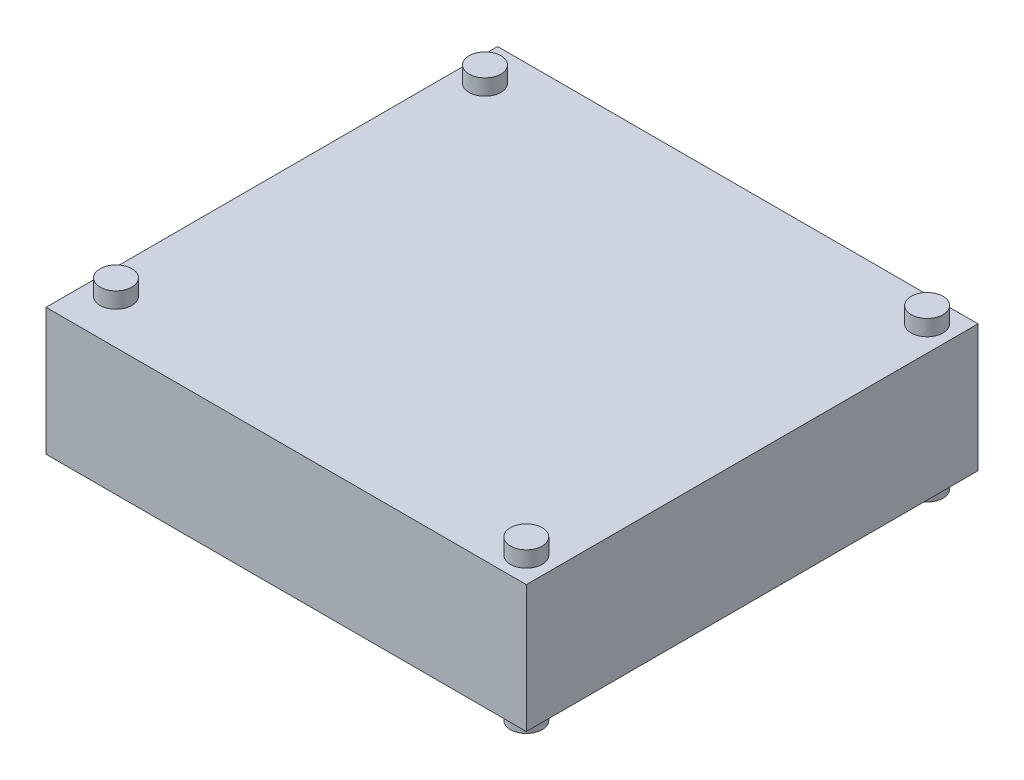
ISO-10303-21;
HEADER;
FILE_DESCRIPTION(('STEP AP214'),'2;1');
FILE_NAME('part.step','',(''),(''),'','','');
FILE_SCHEMA(('AUTOMOTIVE_DESIGN { 1 0 10303 214 1 1 1 1 }'));
ENDSEC;
DATA;
#1=APPLICATION_CONTEXT('core data for automotive mechanical design processes');
#2=APPLICATION_PROTOCOL_DEFINITION('international standard','automotive_design',2000,#1);
#3=PRODUCT_CONTEXT('',#1,'mechanical');
#4=PRODUCT('Part','Part','',(#3));
#5=PRODUCT_RELATED_PRODUCT_CATEGORY('part','',(#4));
#6=PRODUCT_DEFINITION_FORMATION('','',#4);
#7=PRODUCT_DEFINITION_CONTEXT('part definition',#1,'design');
#8=PRODUCT_DEFINITION('design','',#6,#7);
#9=PRODUCT_DEFINITION_SHAPE('','',#8);
#10=(LENGTH_UNIT() NAMED_UNIT(*) SI_UNIT(.MILLI.,.METRE.));
#11=(NAMED_UNIT(*) PLANE_ANGLE_UNIT() SI_UNIT($,.RADIAN.));
#12=(NAMED_UNIT(*) SI_UNIT($,.STERADIAN.) SOLID_ANGLE_UNIT());
#13=UNCERTAINTY_MEASURE_WITH_UNIT(LENGTH_MEASURE(1.E-05),#10,'distance_accuracy_value','');
#14=(GEOMETRIC_REPRESENTATION_CONTEXT(3) GLOBAL_UNCERTAINTY_ASSIGNED_CONTEXT((#13)) GLOBAL_UNIT_ASSIGNED_CONTEXT((#10,
#11,#12)) REPRESENTATION_CONTEXT('',''));
#15=CARTESIAN_POINT('',(0.,0.,0.));
#16=DIRECTION('',(0.,0.,1.));
#17=DIRECTION('',(1.,0.,0.));
#18=AXIS2_PLACEMENT_3D('',#15,#16,#17);
#19=CARTESIAN_POINT('',(0.,25.4,0.));
#20=DIRECTION('',(0.,1.,0.));
#21=DIRECTION('',(0.,0.,1.));
#22=AXIS2_PLACEMENT_3D('',#19,#20,#21);
#23=PLANE('',#22);
#24=CARTESIAN_POINT('',(42.8625,25.4,-40.005));
#25=DIRECTION('',(0.,1.,0.));
#26=DIRECTION('',(0.,0.,1.));
#27=AXIS2_PLACEMENT_3D('',#24,#25,#26);
#28=CIRCLE('',#27,3.175);
#29=CARTESIAN_POINT('',(42.8625,25.4,-36.83));
#30=VERTEX_POINT('',#29);
#31=EDGE_CURVE('E116',#30,#30,#28,.T.);
#32=ORIENTED_EDGE('',*,*,#31,.F.);
#33=EDGE_LOOP('',(#32));
#34=FACE_BOUND('',#33,.T.);
#35=CARTESIAN_POINT('',(-42.8625,25.4,-37.465));
#36=DIRECTION('',(0.,1.,0.));
#37=DIRECTION('',(0.,0.,1.));
#38=AXIS2_PLACEMENT_3D('',#35,#36,#37);
#39=CIRCLE('',#38,3.175);
#40=CARTESIAN_POINT('',(-42.8625,25.4,-34.29));
#41=VERTEX_POINT('',#40);
#42=EDGE_CURVE('E99',#41,#41,#39,.T.);
#43=ORIENTED_EDGE('',*,*,#42,.F.);
#44=EDGE_LOOP('',(#43));
#45=FACE_BOUND('',#44,.T.);
#46=DIRECTION('',(0.,0.,-1.));
#47=VECTOR('',#46,1.);
#48=CARTESIAN_POINT('',(47.9425,25.4,-45.085));
#49=LINE('',#48,#47);
#50=CARTESIAN_POINT('',(47.9425,25.4,45.085));
#51=VERTEX_POINT('',#50);
#52=CARTESIAN_POINT('',(47.9425,25.4,-45.085));
#53=VERTEX_POINT('',#52);
#54=EDGE_CURVE('E84',#51,#53,#49,.T.);
#55=ORIENTED_EDGE('',*,*,#54,.T.);
#56=DIRECTION('',(-1.,0.,0.));
#57=VECTOR('',#56,1.);
#58=CARTESIAN_POINT('',(-47.9425,25.4,-45.085));
#59=LINE('',#58,#57);
#60=CARTESIAN_POINT('',(-47.9425,25.4,-45.085));
#61=VERTEX_POINT('',#60);
#62=EDGE_CURVE('E79',#53,#61,#59,.T.);
#63=ORIENTED_EDGE('',*,*,#62,.T.);
#64=DIRECTION('',(0.,0.,1.));
#65=VECTOR('',#64,1.);
#66=CARTESIAN_POINT('',(-47.9425,25.4,-45.085));
#67=LINE('',#66,#65);
#68=CARTESIAN_POINT('',(-47.9425,25.4,45.085));
#69=VERTEX_POINT('',#68);
#70=EDGE_CURVE('E82',#61,#69,#67,.T.);
#71=ORIENTED_EDGE('',*,*,#70,.T.);
#72=DIRECTION('',(1.,0.,0.));
#73=VECTOR('',#72,1.);
#74=CARTESIAN_POINT('',(-47.9425,25.4,45.085));
#75=LINE('',#74,#73);
#76=EDGE_CURVE('E49',#69,#51,#75,.T.);
#77=ORIENTED_EDGE('',*,*,#76,.T.);
#78=EDGE_LOOP('',(#55,#63,#71,#77));
#79=FACE_BOUND('',#78,.T.);
#80=CARTESIAN_POINT('',(-42.8625,25.4,36.195));
#81=DIRECTION('',(0.,1.,0.));
#82=DIRECTION('',(0.,0.,1.));
#83=AXIS2_PLACEMENT_3D('',#80,#81,#82);
#84=CIRCLE('',#83,3.175);
#85=CARTESIAN_POINT('',(-42.8625,25.4,39.37));
#86=VERTEX_POINT('',#85);
#87=EDGE_CURVE('E113',#86,#86,#84,.T.);
#88=ORIENTED_EDGE('',*,*,#87,.F.);
#89=EDGE_LOOP('',(#88));
#90=FACE_BOUND('',#89,.T.);
#91=CARTESIAN_POINT('',(42.8625,25.4,40.005));
#92=DIRECTION('',(0.,1.,0.));
#93=DIRECTION('',(0.,0.,1.));
#94=AXIS2_PLACEMENT_3D('',#91,#92,#93);
#95=CIRCLE('',#94,3.175);
#96=CARTESIAN_POINT('',(42.8625,25.4,43.18));
#97=VERTEX_POINT('',#96);
#98=EDGE_CURVE('E119',#97,#97,#95,.T.);
#99=ORIENTED_EDGE('',*,*,#98,.F.);
#100=EDGE_LOOP('',(#99));
#101=FACE_BOUND('',#100,.T.);
#102=ADVANCED_FACE('F32',(#34,#45,#79,#90,#101),#23,.T.);
#103=CARTESIAN_POINT('',(0.,0.,0.));
#104=DIRECTION('',(0.,1.,0.));
#105=DIRECTION('',(0.,0.,1.));
#106=AXIS2_PLACEMENT_3D('',#103,#104,#105);
#107=PLANE('',#106);
#108=DIRECTION('',(0.,0.,-1.));
#109=VECTOR('',#108,1.);
#110=CARTESIAN_POINT('',(47.9425,0.,-45.085));
#111=LINE('',#110,#109);
#112=CARTESIAN_POINT('',(47.9425,0.,45.085));
#113=VERTEX_POINT('',#112);
#114=CARTESIAN_POINT('',(47.9425,0.,-45.085));
#115=VERTEX_POINT('',#114);
#116=EDGE_CURVE('E96',#113,#115,#111,.T.);
#117=ORIENTED_EDGE('',*,*,#116,.F.);
#118=DIRECTION('',(1.,0.,0.));
#119=VECTOR('',#118,1.);
#120=CARTESIAN_POINT('',(-47.9425,0.,45.085));
#121=LINE('',#120,#119);
#122=CARTESIAN_POINT('',(-47.9425,0.,45.085));
#123=VERTEX_POINT('',#122);
#124=EDGE_CURVE('E72',#123,#113,#121,.T.);
#125=ORIENTED_EDGE('',*,*,#124,.F.);
#126=DIRECTION('',(0.,0.,1.));
#127=VECTOR('',#126,1.);
#128=CARTESIAN_POINT('',(-47.9425,0.,-45.085));
#129=LINE('',#128,#127);
#130=CARTESIAN_POINT('',(-47.9425,0.,-45.085));
#131=VERTEX_POINT('',#130);
#132=EDGE_CURVE('E66',#131,#123,#129,.T.);
#133=ORIENTED_EDGE('',*,*,#132,.F.);
#134=DIRECTION('',(-1.,0.,0.));
#135=VECTOR('',#134,1.);
#136=CARTESIAN_POINT('',(-47.9425,0.,-45.085));
#137=LINE('',#136,#135);
#138=EDGE_CURVE('E88',#115,#131,#137,.T.);
#139=ORIENTED_EDGE('',*,*,#138,.F.);
#140=EDGE_LOOP('',(#117,#125,#133,#139));
#141=FACE_BOUND('',#140,.T.);
#142=CARTESIAN_POINT('',(-42.8625,0.,-37.465));
#143=DIRECTION('',(0.,1.,0.));
#144=DIRECTION('',(0.,0.,1.));
#145=AXIS2_PLACEMENT_3D('',#142,#143,#144);
#146=CIRCLE('',#145,3.175);
#147=CARTESIAN_POINT('',(-42.8625,0.,-34.29));
#148=VERTEX_POINT('',#147);
#149=EDGE_CURVE('E131',#148,#148,#146,.T.);
#150=ORIENTED_EDGE('',*,*,#149,.T.);
#151=EDGE_LOOP('',(#150));
#152=FACE_BOUND('',#151,.T.);
#153=CARTESIAN_POINT('',(-42.8625,0.,36.195));
#154=DIRECTION('',(0.,1.,0.));
#155=DIRECTION('',(0.,0.,1.));
#156=AXIS2_PLACEMENT_3D('',#153,#154,#155);
#157=CIRCLE('',#156,3.175);
#158=CARTESIAN_POINT('',(-42.8625,0.,39.37));
#159=VERTEX_POINT('',#158);
#160=EDGE_CURVE('E122',#159,#159,#157,.T.);
#161=ORIENTED_EDGE('',*,*,#160,.T.);
#162=EDGE_LOOP('',(#161));
#163=FACE_BOUND('',#162,.T.);
#164=CARTESIAN_POINT('',(42.8625,0.,-40.005));
#165=DIRECTION('',(0.,1.,0.));
#166=DIRECTION('',(0.,0.,1.));
#167=AXIS2_PLACEMENT_3D('',#164,#165,#166);
#168=CIRCLE('',#167,3.175);
#169=CARTESIAN_POINT('',(42.8625,0.,-36.83));
#170=VERTEX_POINT('',#169);
#171=EDGE_CURVE('E140',#170,#170,#168,.T.);
#172=ORIENTED_EDGE('',*,*,#171,.T.);
#173=EDGE_LOOP('',(#172));
#174=FACE_BOUND('',#173,.T.);
#175=CARTESIAN_POINT('',(42.8625,0.,40.005));
#176=DIRECTION('',(0.,1.,0.));
#177=DIRECTION('',(0.,0.,1.));
#178=AXIS2_PLACEMENT_3D('',#175,#176,#177);
#179=CIRCLE('',#178,3.175);
#180=CARTESIAN_POINT('',(42.8625,0.,43.18));
#181=VERTEX_POINT('',#180);
#182=EDGE_CURVE('E149',#181,#181,#179,.T.);
#183=ORIENTED_EDGE('',*,*,#182,.T.);
#184=EDGE_LOOP('',(#183));
#185=FACE_BOUND('',#184,.T.);
#186=ADVANCED_FACE('F107',(#141,#152,#163,#174,#185),#107,.F.);
#187=CARTESIAN_POINT('',(47.9425,25.4,-45.085));
#188=DIRECTION('',(-1.,0.,0.));
#189=DIRECTION('',(0.,0.,1.));
#190=AXIS2_PLACEMENT_3D('',#187,#188,#189);
#191=PLANE('',#190);
#192=ORIENTED_EDGE('',*,*,#116,.T.);
#193=DIRECTION('',(0.,-1.,0.));
#194=VECTOR('',#193,1.);
#195=CARTESIAN_POINT('',(47.9425,25.4,-45.085));
#196=LINE('',#195,#194);
#197=EDGE_CURVE('E11',#53,#115,#196,.T.);
#198=ORIENTED_EDGE('',*,*,#197,.F.);
#199=ORIENTED_EDGE('',*,*,#54,.F.);
#200=DIRECTION('',(0.,-1.,0.));
#201=VECTOR('',#200,1.);
#202=CARTESIAN_POINT('',(47.9425,25.4,45.085));
#203=LINE('',#202,#201);
#204=EDGE_CURVE('E92',#51,#113,#203,.T.);
#205=ORIENTED_EDGE('',*,*,#204,.T.);
#206=EDGE_LOOP('',(#192,#198,#199,#205));
#207=FACE_BOUND('',#206,.T.);
#208=ADVANCED_FACE('F34',(#207),#191,.F.);
#209=CARTESIAN_POINT('',(-47.9425,25.4,-45.085));
#210=DIRECTION('',(0.,0.,1.));
#211=DIRECTION('',(1.,0.,0.));
#212=AXIS2_PLACEMENT_3D('',#209,#210,#211);
#213=PLANE('',#212);
#214=ORIENTED_EDGE('',*,*,#138,.T.);
#215=DIRECTION('',(0.,-1.,0.));
#216=VECTOR('',#215,1.);
#217=CARTESIAN_POINT('',(-47.9425,25.4,-45.085));
#218=LINE('',#217,#216);
#219=EDGE_CURVE('E41',#61,#131,#218,.T.);
#220=ORIENTED_EDGE('',*,*,#219,.F.);
#221=ORIENTED_EDGE('',*,*,#62,.F.);
#222=ORIENTED_EDGE('',*,*,#197,.T.);
#223=EDGE_LOOP('',(#214,#220,#221,#222));
#224=FACE_BOUND('',#223,.T.);
#225=ADVANCED_FACE('F87',(#224),#213,.F.);
#226=CARTESIAN_POINT('',(-47.9425,25.4,-45.085));
#227=DIRECTION('',(1.,0.,0.));
#228=DIRECTION('',(0.,0.,-1.));
#229=AXIS2_PLACEMENT_3D('',#226,#227,#228);
#230=PLANE('',#229);
#231=ORIENTED_EDGE('',*,*,#132,.T.);
#232=DIRECTION('',(0.,-1.,0.));
#233=VECTOR('',#232,1.);
#234=CARTESIAN_POINT('',(-47.9425,25.4,45.085));
#235=LINE('',#234,#233);
#236=EDGE_CURVE('E89',#69,#123,#235,.T.);
#237=ORIENTED_EDGE('',*,*,#236,.F.);
#238=ORIENTED_EDGE('',*,*,#70,.F.);
#239=ORIENTED_EDGE('',*,*,#219,.T.);
#240=EDGE_LOOP('',(#231,#237,#238,#239));
#241=FACE_BOUND('',#240,.T.);
#242=ADVANCED_FACE('F90',(#241),#230,.F.);
#243=CARTESIAN_POINT('',(-47.9425,25.4,45.085));
#244=DIRECTION('',(0.,0.,-1.));
#245=DIRECTION('',(-1.,0.,0.));
#246=AXIS2_PLACEMENT_3D('',#243,#244,#245);
#247=PLANE('',#246);
#248=ORIENTED_EDGE('',*,*,#124,.T.);
#249=ORIENTED_EDGE('',*,*,#204,.F.);
#250=ORIENTED_EDGE('',*,*,#76,.F.);
#251=ORIENTED_EDGE('',*,*,#236,.T.);
#252=EDGE_LOOP('',(#248,#249,#250,#251));
#253=FACE_BOUND('',#252,.T.);
#254=ADVANCED_FACE('F104',(#253),#247,.F.);
#255=CARTESIAN_POINT('',(0.,-3.175,0.));
#256=DIRECTION('',(0.,1.,0.));
#257=DIRECTION('',(0.,0.,1.));
#258=AXIS2_PLACEMENT_3D('',#255,#256,#257);
#259=PLANE('',#258);
#260=CARTESIAN_POINT('',(-42.8625,-3.175,36.195));
#261=DIRECTION('',(0.,1.,0.));
#262=DIRECTION('',(0.,0.,1.));
#263=AXIS2_PLACEMENT_3D('',#260,#261,#262);
#264=CIRCLE('',#263,3.175);
#265=CARTESIAN_POINT('',(-42.8625,-3.175,39.37));
#266=VERTEX_POINT('',#265);
#267=EDGE_CURVE('E125',#266,#266,#264,.T.);
#268=ORIENTED_EDGE('',*,*,#267,.F.);
#269=EDGE_LOOP('',(#268));
#270=FACE_BOUND('',#269,.T.);
#271=ADVANCED_FACE('F191',(#270),#259,.F.);
#272=CARTESIAN_POINT('',(-42.8625,-3.175,36.195));
#273=DIRECTION('',(0.,1.,0.));
#274=DIRECTION('',(0.,0.,1.));
#275=AXIS2_PLACEMENT_3D('',#272,#273,#274);
#276=CYLINDRICAL_SURFACE('',#275,3.175);
#277=ORIENTED_EDGE('',*,*,#267,.T.);
#278=EDGE_LOOP('',(#277));
#279=FACE_BOUND('',#278,.T.);
#280=ORIENTED_EDGE('',*,*,#160,.F.);
#281=EDGE_LOOP('',(#280));
#282=FACE_BOUND('',#281,.T.);
#283=ADVANCED_FACE('F233',(#279,#282),#276,.T.);
#284=ORIENTED_EDGE('',*,*,#87,.T.);
#285=EDGE_LOOP('',(#284));
#286=FACE_BOUND('',#285,.T.);
#287=CARTESIAN_POINT('',(-42.8625,28.575,36.195));
#288=DIRECTION('',(0.,1.,0.));
#289=DIRECTION('',(0.,0.,1.));
#290=AXIS2_PLACEMENT_3D('',#287,#288,#289);
#291=CIRCLE('',#290,3.175);
#292=CARTESIAN_POINT('',(-42.8625,28.575,39.37));
#293=VERTEX_POINT('',#292);
#294=EDGE_CURVE('E128',#293,#293,#291,.T.);
#295=ORIENTED_EDGE('',*,*,#294,.F.);
#296=EDGE_LOOP('',(#295));
#297=FACE_BOUND('',#296,.T.);
#298=ADVANCED_FACE('F186',(#286,#297),#276,.T.);
#299=CARTESIAN_POINT('',(0.,28.575,0.));
#300=DIRECTION('',(0.,1.,0.));
#301=DIRECTION('',(0.,0.,1.));
#302=AXIS2_PLACEMENT_3D('',#299,#300,#301);
#303=PLANE('',#302);
#304=ORIENTED_EDGE('',*,*,#294,.T.);
#305=EDGE_LOOP('',(#304));
#306=FACE_BOUND('',#305,.T.);
#307=ADVANCED_FACE('F248',(#306),#303,.T.);
#308=CARTESIAN_POINT('',(-42.8625,-3.175,-37.465));
#309=DIRECTION('',(0.,1.,0.));
#310=DIRECTION('',(0.,0.,1.));
#311=AXIS2_PLACEMENT_3D('',#308,#309,#310);
#312=PLANE('',#311);
#313=CARTESIAN_POINT('',(-42.8625,-3.175,-37.465));
#314=DIRECTION('',(0.,1.,0.));
#315=DIRECTION('',(0.,0.,1.));
#316=AXIS2_PLACEMENT_3D('',#313,#314,#315);
#317=CIRCLE('',#316,3.175);
#318=CARTESIAN_POINT('',(-42.8625,-3.175,-34.29));
#319=VERTEX_POINT('',#318);
#320=EDGE_CURVE('E137',#319,#319,#317,.T.);
#321=ORIENTED_EDGE('',*,*,#320,.F.);
#322=EDGE_LOOP('',(#321));
#323=FACE_BOUND('',#322,.T.);
#324=ADVANCED_FACE('F256',(#323),#312,.F.);
#325=CARTESIAN_POINT('',(-42.8625,-3.175,-37.465));
#326=DIRECTION('',(0.,1.,0.));
#327=DIRECTION('',(0.,0.,1.));
#328=AXIS2_PLACEMENT_3D('',#325,#326,#327);
#329=CYLINDRICAL_SURFACE('',#328,3.175);
#330=ORIENTED_EDGE('',*,*,#320,.T.);
#331=EDGE_LOOP('',(#330));
#332=FACE_BOUND('',#331,.T.);
#333=ORIENTED_EDGE('',*,*,#149,.F.);
#334=EDGE_LOOP('',(#333));
#335=FACE_BOUND('',#334,.T.);
#336=ADVANCED_FACE('F265',(#332,#335),#329,.T.);
#337=ORIENTED_EDGE('',*,*,#42,.T.);
#338=EDGE_LOOP('',(#337));
#339=FACE_BOUND('',#338,.T.);
#340=CARTESIAN_POINT('',(-42.8625,28.575,-37.465));
#341=DIRECTION('',(0.,1.,0.));
#342=DIRECTION('',(0.,0.,1.));
#343=AXIS2_PLACEMENT_3D('',#340,#341,#342);
#344=CIRCLE('',#343,3.175);
#345=CARTESIAN_POINT('',(-42.8625,28.575,-34.29));
#346=VERTEX_POINT('',#345);
#347=EDGE_CURVE('E134',#346,#346,#344,.T.);
#348=ORIENTED_EDGE('',*,*,#347,.F.);
#349=EDGE_LOOP('',(#348));
#350=FACE_BOUND('',#349,.T.);
#351=ADVANCED_FACE('F274',(#339,#350),#329,.T.);
#352=CARTESIAN_POINT('',(-42.8625,28.575,-37.465));
#353=DIRECTION('',(0.,1.,0.));
#354=DIRECTION('',(0.,0.,1.));
#355=AXIS2_PLACEMENT_3D('',#352,#353,#354);
#356=PLANE('',#355);
#357=ORIENTED_EDGE('',*,*,#347,.T.);
#358=EDGE_LOOP('',(#357));
#359=FACE_BOUND('',#358,.T.);
#360=ADVANCED_FACE('F283',(#359),#356,.T.);
#361=CARTESIAN_POINT('',(42.8625,-3.175,-40.005));
#362=DIRECTION('',(0.,1.,0.));
#363=DIRECTION('',(0.,0.,1.));
#364=AXIS2_PLACEMENT_3D('',#361,#362,#363);
#365=PLANE('',#364);
#366=CARTESIAN_POINT('',(42.8625,-3.175,-40.005));
#367=DIRECTION('',(0.,1.,0.));
#368=DIRECTION('',(0.,0.,1.));
#369=AXIS2_PLACEMENT_3D('',#366,#367,#368);
#370=CIRCLE('',#369,3.175);
#371=CARTESIAN_POINT('',(42.8625,-3.175,-36.83));
#372=VERTEX_POINT('',#371);
#373=EDGE_CURVE('E146',#372,#372,#370,.T.);
#374=ORIENTED_EDGE('',*,*,#373,.F.);
#375=EDGE_LOOP('',(#374));
#376=FACE_BOUND('',#375,.T.);
#377=ADVANCED_FACE('F291',(#376),#365,.F.);
#378=CARTESIAN_POINT('',(42.8625,-3.175,-40.005));
#379=DIRECTION('',(0.,1.,0.));
#380=DIRECTION('',(0.,0.,1.));
#381=AXIS2_PLACEMENT_3D('',#378,#379,#380);
#382=CYLINDRICAL_SURFACE('',#381,3.175);
#383=ORIENTED_EDGE('',*,*,#373,.T.);
#384=EDGE_LOOP('',(#383));
#385=FACE_BOUND('',#384,.T.);
#386=ORIENTED_EDGE('',*,*,#171,.F.);
#387=EDGE_LOOP('',(#386));
#388=FACE_BOUND('',#387,.T.);
#389=ADVANCED_FACE('F300',(#385,#388),#382,.T.);
#390=ORIENTED_EDGE('',*,*,#31,.T.);
#391=EDGE_LOOP('',(#390));
#392=FACE_BOUND('',#391,.T.);
#393=CARTESIAN_POINT('',(42.8625,28.575,-40.005));
#394=DIRECTION('',(0.,1.,0.));
#395=DIRECTION('',(0.,0.,1.));
#396=AXIS2_PLACEMENT_3D('',#393,#394,#395);
#397=CIRCLE('',#396,3.175);
#398=CARTESIAN_POINT('',(42.8625,28.575,-36.83));
#399=VERTEX_POINT('',#398);
#400=EDGE_CURVE('E143',#399,#399,#397,.T.);
#401=ORIENTED_EDGE('',*,*,#400,.F.);
#402=EDGE_LOOP('',(#401));
#403=FACE_BOUND('',#402,.T.);
#404=ADVANCED_FACE('F172',(#392,#403),#382,.T.);
#405=CARTESIAN_POINT('',(42.8625,28.575,-40.005));
#406=DIRECTION('',(0.,1.,0.));
#407=DIRECTION('',(0.,0.,1.));
#408=AXIS2_PLACEMENT_3D('',#405,#406,#407);
#409=PLANE('',#408);
#410=ORIENTED_EDGE('',*,*,#400,.T.);
#411=EDGE_LOOP('',(#410));
#412=FACE_BOUND('',#411,.T.);
#413=ADVANCED_FACE('F164',(#412),#409,.T.);
#414=CARTESIAN_POINT('',(42.8625,-3.175,40.005));
#415=DIRECTION('',(0.,1.,0.));
#416=DIRECTION('',(0.,0.,1.));
#417=AXIS2_PLACEMENT_3D('',#414,#415,#416);
#418=PLANE('',#417);
#419=CARTESIAN_POINT('',(42.8625,-3.175,40.005));
#420=DIRECTION('',(0.,1.,0.));
#421=DIRECTION('',(0.,0.,1.));
#422=AXIS2_PLACEMENT_3D('',#419,#420,#421);
#423=CIRCLE('',#422,3.175);
#424=CARTESIAN_POINT('',(42.8625,-3.175,43.18));
#425=VERTEX_POINT('',#424);
#426=EDGE_CURVE('E155',#425,#425,#423,.T.);
#427=ORIENTED_EDGE('',*,*,#426,.F.);
#428=EDGE_LOOP('',(#427));
#429=FACE_BOUND('',#428,.T.);
#430=ADVANCED_FACE('F162',(#429),#418,.F.);
#431=CARTESIAN_POINT('',(42.8625,-3.175,40.005));
#432=DIRECTION('',(0.,1.,0.));
#433=DIRECTION('',(0.,0.,1.));
#434=AXIS2_PLACEMENT_3D('',#431,#432,#433);
#435=CYLINDRICAL_SURFACE('',#434,3.175);
#436=ORIENTED_EDGE('',*,*,#426,.T.);
#437=EDGE_LOOP('',(#436));
#438=FACE_BOUND('',#437,.T.);
#439=ORIENTED_EDGE('',*,*,#182,.F.);
#440=EDGE_LOOP('',(#439));
#441=FACE_BOUND('',#440,.T.);
#442=ADVANCED_FACE('F159',(#438,#441),#435,.T.);
#443=ORIENTED_EDGE('',*,*,#98,.T.);
#444=EDGE_LOOP('',(#443));
#445=FACE_BOUND('',#444,.T.);
#446=CARTESIAN_POINT('',(42.8625,28.575,40.005));
#447=DIRECTION('',(0.,1.,0.));
#448=DIRECTION('',(0.,0.,1.));
#449=AXIS2_PLACEMENT_3D('',#446,#447,#448);
#450=CIRCLE('',#449,3.175);
#451=CARTESIAN_POINT('',(42.8625,28.575,43.18));
#452=VERTEX_POINT('',#451);
#453=EDGE_CURVE('E152',#452,#452,#450,.T.);
#454=ORIENTED_EDGE('',*,*,#453,.F.);
#455=EDGE_LOOP('',(#454));
#456=FACE_BOUND('',#455,.T.);
#457=ADVANCED_FACE('F170',(#445,#456),#435,.T.);
#458=CARTESIAN_POINT('',(42.8625,28.575,40.005));
#459=DIRECTION('',(0.,1.,0.));
#460=DIRECTION('',(0.,0.,1.));
#461=AXIS2_PLACEMENT_3D('',#458,#459,#460);
#462=PLANE('',#461);
#463=ORIENTED_EDGE('',*,*,#453,.T.);
#464=EDGE_LOOP('',(#463));
#465=FACE_BOUND('',#464,.T.);
#466=ADVANCED_FACE('F338',(#465),#462,.T.);
#467=CLOSED_SHELL('',(#102,#186,#208,#225,#242,#254,#271,#283,#298,#307,#324,#336,#351,#360,
#377,#389,#404,#413,#430,#442,#457,#466));
#468=MANIFOLD_SOLID_BREP('B2',#467);
#469=ADVANCED_BREP_SHAPE_REPRESENTATION('',(#18,#468),#14);
#470=SHAPE_DEFINITION_REPRESENTATION(#9,#469);
ENDSEC;
END-ISO-10303-21;
